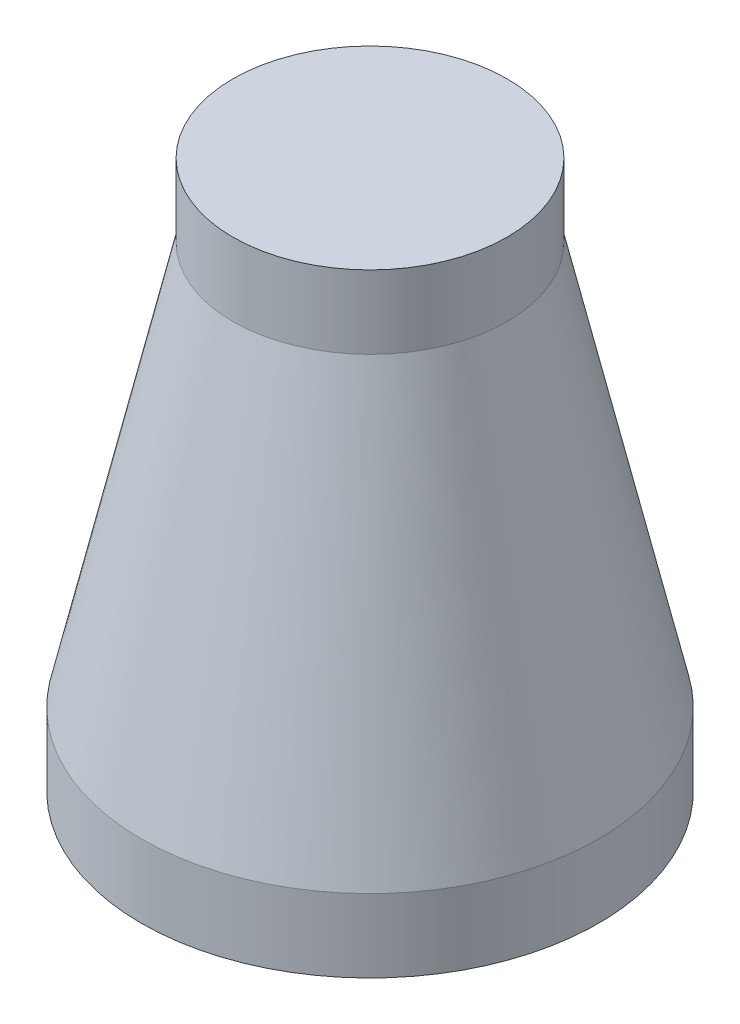
ISO-10303-21;
HEADER;
FILE_DESCRIPTION(('STEP AP214'),'2;1');
FILE_NAME('part.step','',(''),(''),'','','');
FILE_SCHEMA(('AUTOMOTIVE_DESIGN { 1 0 10303 214 1 1 1 1 }'));
ENDSEC;
DATA;
#1=APPLICATION_CONTEXT('core data for automotive mechanical design processes');
#2=APPLICATION_PROTOCOL_DEFINITION('international standard','automotive_design',2000,#1);
#3=PRODUCT_CONTEXT('',#1,'mechanical');
#4=PRODUCT('Part','Part','',(#3));
#5=PRODUCT_RELATED_PRODUCT_CATEGORY('part','',(#4));
#6=PRODUCT_DEFINITION_FORMATION('','',#4);
#7=PRODUCT_DEFINITION_CONTEXT('part definition',#1,'design');
#8=PRODUCT_DEFINITION('design','',#6,#7);
#9=PRODUCT_DEFINITION_SHAPE('','',#8);
#10=(LENGTH_UNIT() NAMED_UNIT(*) SI_UNIT(.MILLI.,.METRE.));
#11=(NAMED_UNIT(*) PLANE_ANGLE_UNIT() SI_UNIT($,.RADIAN.));
#12=(NAMED_UNIT(*) SI_UNIT($,.STERADIAN.) SOLID_ANGLE_UNIT());
#13=UNCERTAINTY_MEASURE_WITH_UNIT(LENGTH_MEASURE(1.E-05),#10,'distance_accuracy_value','');
#14=(GEOMETRIC_REPRESENTATION_CONTEXT(3) GLOBAL_UNCERTAINTY_ASSIGNED_CONTEXT((#13)) GLOBAL_UNIT_ASSIGNED_CONTEXT((#10,
#11,#12)) REPRESENTATION_CONTEXT('',''));
#15=CARTESIAN_POINT('',(0.,0.,0.));
#16=DIRECTION('',(0.,0.,1.));
#17=DIRECTION('',(1.,0.,0.));
#18=AXIS2_PLACEMENT_3D('',#15,#16,#17);
#19=CARTESIAN_POINT('',(25.,0.,0.));
#20=DIRECTION('',(0.,-1.,0.));
#21=DIRECTION('',(0.,0.,-1.));
#22=AXIS2_PLACEMENT_3D('',#19,#20,#21);
#23=PLANE('',#22);
#24=CARTESIAN_POINT('',(0.,0.,0.));
#25=DIRECTION('',(0.,-1.,0.));
#26=DIRECTION('',(0.,0.,-1.));
#27=AXIS2_PLACEMENT_3D('',#24,#25,#26);
#28=CIRCLE('',#27,25.);
#29=CARTESIAN_POINT('',(0.,0.,-25.));
#30=VERTEX_POINT('',#29);
#31=EDGE_CURVE('E52',#30,#30,#28,.T.);
#32=ORIENTED_EDGE('',*,*,#31,.T.);
#33=EDGE_LOOP('',(#32));
#34=FACE_BOUND('',#33,.T.);
#35=ADVANCED_FACE('F39',(#34),#23,.T.);
#36=CARTESIAN_POINT('',(0.,60.,0.));
#37=DIRECTION('',(0.,1.,0.));
#38=DIRECTION('',(0.,0.,1.));
#39=AXIS2_PLACEMENT_3D('',#36,#37,#38);
#40=PLANE('',#39);
#41=CARTESIAN_POINT('',(0.,60.,0.));
#42=DIRECTION('',(0.,-1.,0.));
#43=DIRECTION('',(0.,0.,-1.));
#44=AXIS2_PLACEMENT_3D('',#41,#42,#43);
#45=CIRCLE('',#44,15.);
#46=CARTESIAN_POINT('',(0.,60.,-15.));
#47=VERTEX_POINT('',#46);
#48=EDGE_CURVE('E10',#47,#47,#45,.T.);
#49=ORIENTED_EDGE('',*,*,#48,.F.);
#50=EDGE_LOOP('',(#49));
#51=FACE_BOUND('',#50,.T.);
#52=ADVANCED_FACE('F72',(#51),#40,.T.);
#53=CARTESIAN_POINT('',(0.,0.,0.));
#54=DIRECTION('',(0.,-1.,0.));
#55=DIRECTION('',(0.,0.,-1.));
#56=AXIS2_PLACEMENT_3D('',#53,#54,#55);
#57=CYLINDRICAL_SURFACE('',#56,15.);
#58=ORIENTED_EDGE('',*,*,#48,.T.);
#59=EDGE_LOOP('',(#58));
#60=FACE_BOUND('',#59,.T.);
#61=CARTESIAN_POINT('',(0.,52.,0.));
#62=DIRECTION('',(0.,-1.,0.));
#63=DIRECTION('',(0.,0.,-1.));
#64=AXIS2_PLACEMENT_3D('',#61,#62,#63);
#65=CIRCLE('',#64,15.);
#66=CARTESIAN_POINT('',(0.,52.,-15.));
#67=VERTEX_POINT('',#66);
#68=EDGE_CURVE('E44',#67,#67,#65,.T.);
#69=ORIENTED_EDGE('',*,*,#68,.F.);
#70=EDGE_LOOP('',(#69));
#71=FACE_BOUND('',#70,.T.);
#72=ADVANCED_FACE('F70',(#60,#71),#57,.T.);
#73=CARTESIAN_POINT('',(0.,8.,0.));
#74=DIRECTION('',(0.,-1.,0.));
#75=DIRECTION('',(0.,0.,-1.));
#76=AXIS2_PLACEMENT_3D('',#73,#74,#75);
#77=CONICAL_SURFACE('',#76,25.,0.223476601140633);
#78=ORIENTED_EDGE('',*,*,#68,.T.);
#79=EDGE_LOOP('',(#78));
#80=FACE_BOUND('',#79,.T.);
#81=CARTESIAN_POINT('',(0.,8.,0.));
#82=DIRECTION('',(0.,-1.,0.));
#83=DIRECTION('',(0.,0.,-1.));
#84=AXIS2_PLACEMENT_3D('',#81,#82,#83);
#85=CIRCLE('',#84,25.);
#86=CARTESIAN_POINT('',(0.,8.,-25.));
#87=VERTEX_POINT('',#86);
#88=EDGE_CURVE('E47',#87,#87,#85,.T.);
#89=ORIENTED_EDGE('',*,*,#88,.F.);
#90=EDGE_LOOP('',(#89));
#91=FACE_BOUND('',#90,.T.);
#92=ADVANCED_FACE('F65',(#80,#91),#77,.T.);
#93=CARTESIAN_POINT('',(0.,0.,0.));
#94=DIRECTION('',(0.,-1.,0.));
#95=DIRECTION('',(0.,0.,-1.));
#96=AXIS2_PLACEMENT_3D('',#93,#94,#95);
#97=CYLINDRICAL_SURFACE('',#96,25.);
#98=ORIENTED_EDGE('',*,*,#88,.T.);
#99=EDGE_LOOP('',(#98));
#100=FACE_BOUND('',#99,.T.);
#101=ORIENTED_EDGE('',*,*,#31,.F.);
#102=EDGE_LOOP('',(#101));
#103=FACE_BOUND('',#102,.T.);
#104=ADVANCED_FACE('F58',(#100,#103),#97,.T.);
#105=CLOSED_SHELL('',(#35,#52,#72,#92,#104));
#106=MANIFOLD_SOLID_BREP('B2',#105);
#107=ADVANCED_BREP_SHAPE_REPRESENTATION('',(#18,#106),#14);
#108=SHAPE_DEFINITION_REPRESENTATION(#9,#107);
ENDSEC;
END-ISO-10303-21;
